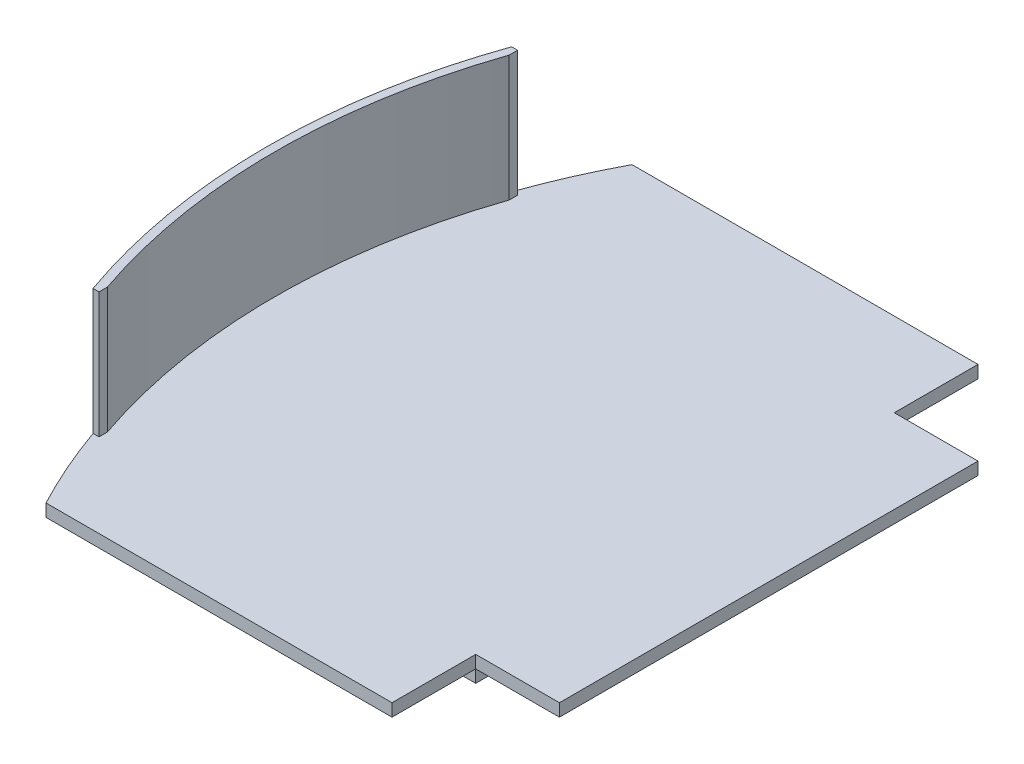
ISO-10303-21;
HEADER;
FILE_DESCRIPTION(('STEP AP214'),'2;1');
FILE_NAME('part.step','',(''),(''),'','','');
FILE_SCHEMA(('AUTOMOTIVE_DESIGN { 1 0 10303 214 1 1 1 1 }'));
ENDSEC;
DATA;
#1=APPLICATION_CONTEXT('core data for automotive mechanical design processes');
#2=APPLICATION_PROTOCOL_DEFINITION('international standard','automotive_design',2000,#1);
#3=PRODUCT_CONTEXT('',#1,'mechanical');
#4=PRODUCT('Part','Part','',(#3));
#5=PRODUCT_RELATED_PRODUCT_CATEGORY('part','',(#4));
#6=PRODUCT_DEFINITION_FORMATION('','',#4);
#7=PRODUCT_DEFINITION_CONTEXT('part definition',#1,'design');
#8=PRODUCT_DEFINITION('design','',#6,#7);
#9=PRODUCT_DEFINITION_SHAPE('','',#8);
#10=(LENGTH_UNIT() NAMED_UNIT(*) SI_UNIT(.MILLI.,.METRE.));
#11=(NAMED_UNIT(*) PLANE_ANGLE_UNIT() SI_UNIT($,.RADIAN.));
#12=(NAMED_UNIT(*) SI_UNIT($,.STERADIAN.) SOLID_ANGLE_UNIT());
#13=UNCERTAINTY_MEASURE_WITH_UNIT(LENGTH_MEASURE(1.E-05),#10,'distance_accuracy_value','');
#14=(GEOMETRIC_REPRESENTATION_CONTEXT(3) GLOBAL_UNCERTAINTY_ASSIGNED_CONTEXT((#13)) GLOBAL_UNIT_ASSIGNED_CONTEXT((#10,
#11,#12)) REPRESENTATION_CONTEXT('',''));
#15=CARTESIAN_POINT('',(0.,0.,0.));
#16=DIRECTION('',(0.,0.,1.));
#17=DIRECTION('',(1.,0.,0.));
#18=AXIS2_PLACEMENT_3D('',#15,#16,#17);
#19=CARTESIAN_POINT('',(-233.563874270696,36.,0.));
#20=DIRECTION('',(0.,1.,0.));
#21=DIRECTION('',(0.,0.,1.));
#22=AXIS2_PLACEMENT_3D('',#19,#20,#21);
#23=PLANE('',#22);
#24=DIRECTION('',(0.,0.,1.));
#25=VECTOR('',#24,1.);
#26=CARTESIAN_POINT('',(-140.,36.,-70.000025));
#27=LINE('',#26,#25);
#28=CARTESIAN_POINT('',(-140.,36.,-50.));
#29=VERTEX_POINT('',#28);
#30=CARTESIAN_POINT('',(-140.,36.,-48.));
#31=VERTEX_POINT('',#30);
#32=EDGE_CURVE('E189',#29,#31,#27,.T.);
#33=ORIENTED_EDGE('',*,*,#32,.F.);
#34=DIRECTION('',(-1.,0.,0.));
#35=VECTOR('',#34,1.);
#36=CARTESIAN_POINT('',(-233.563874270696,36.,-50.));
#37=LINE('',#36,#35);
#38=CARTESIAN_POINT('',(-141.42135623731,36.,-50.));
#39=VERTEX_POINT('',#38);
#40=EDGE_CURVE('E200',#29,#39,#37,.T.);
#41=ORIENTED_EDGE('',*,*,#40,.T.);
#42=CARTESIAN_POINT('',(0.,36.,0.));
#43=DIRECTION('',(0.,1.,0.));
#44=DIRECTION('',(0.,0.,1.));
#45=AXIS2_PLACEMENT_3D('',#42,#43,#44);
#46=CIRCLE('',#45,150.);
#47=CARTESIAN_POINT('',(-141.42135623731,36.,50.));
#48=VERTEX_POINT('',#47);
#49=EDGE_CURVE('E201',#39,#48,#46,.T.);
#50=ORIENTED_EDGE('',*,*,#49,.T.);
#51=DIRECTION('',(-1.,0.,0.));
#52=VECTOR('',#51,1.);
#53=CARTESIAN_POINT('',(-233.563874270696,36.,50.));
#54=LINE('',#53,#52);
#55=CARTESIAN_POINT('',(-140.,36.,50.));
#56=VERTEX_POINT('',#55);
#57=EDGE_CURVE('E214',#56,#48,#54,.T.);
#58=ORIENTED_EDGE('',*,*,#57,.F.);
#59=CARTESIAN_POINT('',(-140.,36.,48.));
#60=VERTEX_POINT('',#59);
#61=EDGE_CURVE('E60',#60,#56,#27,.T.);
#62=ORIENTED_EDGE('',*,*,#61,.F.);
#63=CARTESIAN_POINT('',(1.13797860024079E-12,36.,0.));
#64=DIRECTION('',(0.,1.,0.));
#65=DIRECTION('',(0.,0.,1.));
#66=AXIS2_PLACEMENT_3D('',#63,#64,#65);
#67=CIRCLE('',#66,148.000000000001);
#68=EDGE_CURVE('E371',#31,#60,#67,.T.);
#69=ORIENTED_EDGE('',*,*,#68,.F.);
#70=EDGE_LOOP('',(#33,#41,#50,#58,#62,#69));
#71=FACE_BOUND('',#70,.T.);
#72=ADVANCED_FACE('F34',(#71),#23,.T.);
#73=CARTESIAN_POINT('',(0.,6.,0.));
#74=DIRECTION('',(0.,-1.,0.));
#75=DIRECTION('',(0.,0.,-1.));
#76=AXIS2_PLACEMENT_3D('',#73,#74,#75);
#77=CYLINDRICAL_SURFACE('',#76,148.);
#78=DIRECTION('',(0.,-1.,0.));
#79=VECTOR('',#78,1.);
#80=CARTESIAN_POINT('',(-140.,34.,48.));
#81=LINE('',#80,#79);
#82=CARTESIAN_POINT('',(-140.,6.,48.));
#83=VERTEX_POINT('',#82);
#84=EDGE_CURVE('E381',#60,#83,#81,.T.);
#85=ORIENTED_EDGE('',*,*,#84,.T.);
#86=CARTESIAN_POINT('',(0.,6.,0.));
#87=DIRECTION('',(0.,-1.,0.));
#88=DIRECTION('',(0.,0.,-1.));
#89=AXIS2_PLACEMENT_3D('',#86,#87,#88);
#90=CIRCLE('',#89,148.);
#91=CARTESIAN_POINT('',(-140.,6.,-48.));
#92=VERTEX_POINT('',#91);
#93=EDGE_CURVE('E187',#83,#92,#90,.T.);
#94=ORIENTED_EDGE('',*,*,#93,.T.);
#95=DIRECTION('',(0.,-1.,0.));
#96=VECTOR('',#95,1.);
#97=CARTESIAN_POINT('',(-140.,34.,-48.));
#98=LINE('',#97,#96);
#99=EDGE_CURVE('E383',#31,#92,#98,.T.);
#100=ORIENTED_EDGE('',*,*,#99,.F.);
#101=ORIENTED_EDGE('',*,*,#68,.T.);
#102=EDGE_LOOP('',(#85,#94,#100,#101));
#103=FACE_BOUND('',#102,.T.);
#104=ADVANCED_FACE('F431',(#103),#77,.F.);
#105=CARTESIAN_POINT('',(0.,6.,0.));
#106=DIRECTION('',(0.,-1.,0.));
#107=DIRECTION('',(0.,0.,-1.));
#108=AXIS2_PLACEMENT_3D('',#105,#106,#107);
#109=CYLINDRICAL_SURFACE('',#108,150.);
#110=CARTESIAN_POINT('',(0.,3.,0.));
#111=DIRECTION('',(0.,-1.,0.));
#112=DIRECTION('',(0.,0.,-1.));
#113=AXIS2_PLACEMENT_3D('',#110,#111,#112);
#114=CIRCLE('',#113,150.);
#115=CARTESIAN_POINT('',(-141.42135623731,3.,-50.));
#116=VERTEX_POINT('',#115);
#117=CARTESIAN_POINT('',(-132.664991614216,3.,-70.));
#118=VERTEX_POINT('',#117);
#119=EDGE_CURVE('E403',#116,#118,#114,.T.);
#120=ORIENTED_EDGE('',*,*,#119,.F.);
#121=DIRECTION('',(0.,-1.,0.));
#122=VECTOR('',#121,1.);
#123=CARTESIAN_POINT('',(-141.42135623731,3.,-50.));
#124=LINE('',#123,#122);
#125=CARTESIAN_POINT('',(-141.42135623731,0.,-50.));
#126=VERTEX_POINT('',#125);
#127=EDGE_CURVE('E204',#116,#126,#124,.T.);
#128=ORIENTED_EDGE('',*,*,#127,.T.);
#129=CARTESIAN_POINT('',(0.,0.,0.));
#130=DIRECTION('',(0.,1.,0.));
#131=DIRECTION('',(0.,0.,1.));
#132=AXIS2_PLACEMENT_3D('',#129,#130,#131);
#133=CIRCLE('',#132,150.);
#134=CARTESIAN_POINT('',(-141.42135623731,0.,50.));
#135=VERTEX_POINT('',#134);
#136=EDGE_CURVE('E264',#126,#135,#133,.T.);
#137=ORIENTED_EDGE('',*,*,#136,.T.);
#138=DIRECTION('',(0.,-1.,0.));
#139=VECTOR('',#138,1.);
#140=CARTESIAN_POINT('',(-141.42135623731,3.,50.));
#141=LINE('',#140,#139);
#142=CARTESIAN_POINT('',(-141.42135623731,3.,50.));
#143=VERTEX_POINT('',#142);
#144=EDGE_CURVE('E388',#143,#135,#141,.T.);
#145=ORIENTED_EDGE('',*,*,#144,.F.);
#146=CARTESIAN_POINT('',(0.,3.,0.));
#147=DIRECTION('',(0.,-1.,0.));
#148=DIRECTION('',(0.,0.,-1.));
#149=AXIS2_PLACEMENT_3D('',#146,#147,#148);
#150=CIRCLE('',#149,150.);
#151=CARTESIAN_POINT('',(-132.664991614216,3.,70.));
#152=VERTEX_POINT('',#151);
#153=EDGE_CURVE('E387',#152,#143,#150,.T.);
#154=ORIENTED_EDGE('',*,*,#153,.F.);
#155=DIRECTION('',(0.,-1.,0.));
#156=VECTOR('',#155,1.);
#157=CARTESIAN_POINT('',(-132.664991614216,6.,70.));
#158=LINE('',#157,#156);
#159=CARTESIAN_POINT('',(-132.664991614216,6.,70.));
#160=VERTEX_POINT('',#159);
#161=EDGE_CURVE('E246',#160,#152,#158,.T.);
#162=ORIENTED_EDGE('',*,*,#161,.F.);
#163=CARTESIAN_POINT('',(0.,6.,0.));
#164=DIRECTION('',(0.,1.,0.));
#165=DIRECTION('',(0.,0.,1.));
#166=AXIS2_PLACEMENT_3D('',#163,#164,#165);
#167=CIRCLE('',#166,150.);
#168=CARTESIAN_POINT('',(-141.42135623731,6.,50.));
#169=VERTEX_POINT('',#168);
#170=EDGE_CURVE('E231',#169,#160,#167,.T.);
#171=ORIENTED_EDGE('',*,*,#170,.F.);
#172=DIRECTION('',(0.,-1.,0.));
#173=VECTOR('',#172,1.);
#174=CARTESIAN_POINT('',(-141.42135623731,36.,50.));
#175=LINE('',#174,#173);
#176=EDGE_CURVE('E199',#48,#169,#175,.T.);
#177=ORIENTED_EDGE('',*,*,#176,.F.);
#178=ORIENTED_EDGE('',*,*,#49,.F.);
#179=DIRECTION('',(0.,-1.,0.));
#180=VECTOR('',#179,1.);
#181=CARTESIAN_POINT('',(-141.42135623731,36.,-50.));
#182=LINE('',#181,#180);
#183=CARTESIAN_POINT('',(-141.42135623731,6.,-50.));
#184=VERTEX_POINT('',#183);
#185=EDGE_CURVE('E213',#39,#184,#182,.T.);
#186=ORIENTED_EDGE('',*,*,#185,.T.);
#187=CARTESIAN_POINT('',(-132.664991614216,6.,-70.));
#188=VERTEX_POINT('',#187);
#189=EDGE_CURVE('E239',#188,#184,#167,.T.);
#190=ORIENTED_EDGE('',*,*,#189,.F.);
#191=DIRECTION('',(0.,-1.,0.));
#192=VECTOR('',#191,1.);
#193=CARTESIAN_POINT('',(-132.664991614216,6.,-70.));
#194=LINE('',#193,#192);
#195=EDGE_CURVE('E243',#188,#118,#194,.T.);
#196=ORIENTED_EDGE('',*,*,#195,.T.);
#197=EDGE_LOOP('',(#120,#128,#137,#145,#154,#162,#171,#177,#178,#186,#190,#196));
#198=FACE_BOUND('',#197,.T.);
#199=ADVANCED_FACE('F334',(#198),#109,.T.);
#200=CARTESIAN_POINT('',(-233.563874270696,6.,70.));
#201=DIRECTION('',(0.,0.,-1.));
#202=DIRECTION('',(-1.,0.,0.));
#203=AXIS2_PLACEMENT_3D('',#200,#201,#202);
#204=PLANE('',#203);
#205=DIRECTION('',(-1.,0.,0.));
#206=VECTOR('',#205,1.);
#207=CARTESIAN_POINT('',(-90.,3.,70.));
#208=LINE('',#207,#206);
#209=CARTESIAN_POINT('',(-50.,3.,70.));
#210=VERTEX_POINT('',#209);
#211=EDGE_CURVE('E283',#210,#152,#208,.T.);
#212=ORIENTED_EDGE('',*,*,#211,.F.);
#213=DIRECTION('',(0.,-1.,0.));
#214=VECTOR('',#213,1.);
#215=CARTESIAN_POINT('',(-50.,6.,70.));
#216=LINE('',#215,#214);
#217=CARTESIAN_POINT('',(-50.,6.,70.));
#218=VERTEX_POINT('',#217);
#219=EDGE_CURVE('E249',#218,#210,#216,.T.);
#220=ORIENTED_EDGE('',*,*,#219,.F.);
#221=DIRECTION('',(1.,0.,0.));
#222=VECTOR('',#221,1.);
#223=CARTESIAN_POINT('',(-233.563874270696,6.,70.));
#224=LINE('',#223,#222);
#225=EDGE_CURVE('E234',#160,#218,#224,.T.);
#226=ORIENTED_EDGE('',*,*,#225,.F.);
#227=ORIENTED_EDGE('',*,*,#161,.T.);
#228=EDGE_LOOP('',(#212,#220,#226,#227));
#229=FACE_BOUND('',#228,.T.);
#230=ADVANCED_FACE('F282',(#229),#204,.F.);
#231=CARTESIAN_POINT('',(-50.,6.,0.));
#232=DIRECTION('',(1.,0.,0.));
#233=DIRECTION('',(0.,0.,-1.));
#234=AXIS2_PLACEMENT_3D('',#231,#232,#233);
#235=PLANE('',#234);
#236=DIRECTION('',(0.,0.,-1.));
#237=VECTOR('',#236,1.);
#238=CARTESIAN_POINT('',(-50.,3.,-143.563874270696));
#239=LINE('',#238,#237);
#240=CARTESIAN_POINT('',(-50.,3.,50.));
#241=VERTEX_POINT('',#240);
#242=CARTESIAN_POINT('',(-50.,3.,-50.));
#243=VERTEX_POINT('',#242);
#244=EDGE_CURVE('E295',#241,#243,#239,.T.);
#245=ORIENTED_EDGE('',*,*,#244,.F.);
#246=DIRECTION('',(0.,-1.,0.));
#247=VECTOR('',#246,1.);
#248=CARTESIAN_POINT('',(-50.,3.,50.));
#249=LINE('',#248,#247);
#250=CARTESIAN_POINT('',(-50.,0.,50.));
#251=VERTEX_POINT('',#250);
#252=EDGE_CURVE('E298',#241,#251,#249,.T.);
#253=ORIENTED_EDGE('',*,*,#252,.T.);
#254=DIRECTION('',(0.,0.,1.));
#255=VECTOR('',#254,1.);
#256=CARTESIAN_POINT('',(-50.,0.,0.));
#257=LINE('',#256,#255);
#258=CARTESIAN_POINT('',(-50.,0.,-50.));
#259=VERTEX_POINT('',#258);
#260=EDGE_CURVE('E226',#259,#251,#257,.T.);
#261=ORIENTED_EDGE('',*,*,#260,.F.);
#262=DIRECTION('',(0.,-1.,0.));
#263=VECTOR('',#262,1.);
#264=CARTESIAN_POINT('',(-50.,3.,-50.));
#265=LINE('',#264,#263);
#266=EDGE_CURVE('E300',#243,#259,#265,.T.);
#267=ORIENTED_EDGE('',*,*,#266,.F.);
#268=EDGE_LOOP('',(#245,#253,#261,#267));
#269=FACE_BOUND('',#268,.T.);
#270=ADVANCED_FACE('F297',(#269),#235,.T.);
#271=ORIENTED_EDGE('',*,*,#219,.T.);
#272=DIRECTION('',(0.,0.,1.));
#273=VECTOR('',#272,1.);
#274=CARTESIAN_POINT('',(-50.,3.,-143.563874270696));
#275=LINE('',#274,#273);
#276=EDGE_CURVE('E286',#241,#210,#275,.T.);
#277=ORIENTED_EDGE('',*,*,#276,.F.);
#278=DIRECTION('',(0.,-1.,0.));
#279=VECTOR('',#278,1.);
#280=CARTESIAN_POINT('',(-50.,6.,50.));
#281=LINE('',#280,#279);
#282=CARTESIAN_POINT('',(-50.,6.,50.));
#283=VERTEX_POINT('',#282);
#284=EDGE_CURVE('E252',#283,#241,#281,.T.);
#285=ORIENTED_EDGE('',*,*,#284,.F.);
#286=DIRECTION('',(0.,0.,1.));
#287=VECTOR('',#286,1.);
#288=CARTESIAN_POINT('',(-50.,6.,0.));
#289=LINE('',#288,#287);
#290=EDGE_CURVE('E272',#283,#218,#289,.T.);
#291=ORIENTED_EDGE('',*,*,#290,.T.);
#292=EDGE_LOOP('',(#271,#277,#285,#291));
#293=FACE_BOUND('',#292,.T.);
#294=ADVANCED_FACE('F285',(#293),#235,.T.);
#295=CARTESIAN_POINT('',(-233.563874270696,0.,0.));
#296=DIRECTION('',(0.,1.,0.));
#297=DIRECTION('',(0.,0.,1.));
#298=AXIS2_PLACEMENT_3D('',#295,#296,#297);
#299=PLANE('',#298);
#300=DIRECTION('',(-1.,0.,0.));
#301=VECTOR('',#300,1.);
#302=CARTESIAN_POINT('',(-100.,0.,16.));
#303=LINE('',#302,#301);
#304=CARTESIAN_POINT('',(-110.,0.,16.));
#305=VERTEX_POINT('',#304);
#306=CARTESIAN_POINT('',(-131.,0.,16.));
#307=VERTEX_POINT('',#306);
#308=EDGE_CURVE('E344',#305,#307,#303,.T.);
#309=ORIENTED_EDGE('',*,*,#308,.F.);
#310=DIRECTION('',(0.,0.,1.));
#311=VECTOR('',#310,1.);
#312=CARTESIAN_POINT('',(-110.,0.,-110.141421356237));
#313=LINE('',#312,#311);
#314=CARTESIAN_POINT('',(-110.,0.,-28.));
#315=VERTEX_POINT('',#314);
#316=EDGE_CURVE('E342',#315,#305,#313,.T.);
#317=ORIENTED_EDGE('',*,*,#316,.F.);
#318=DIRECTION('',(1.,0.,0.));
#319=VECTOR('',#318,1.);
#320=CARTESIAN_POINT('',(-100.,0.,-28.));
#321=LINE('',#320,#319);
#322=CARTESIAN_POINT('',(-131.,0.,-28.));
#323=VERTEX_POINT('',#322);
#324=EDGE_CURVE('E352',#323,#315,#321,.T.);
#325=ORIENTED_EDGE('',*,*,#324,.F.);
#326=DIRECTION('',(0.,0.,-1.));
#327=VECTOR('',#326,1.);
#328=CARTESIAN_POINT('',(-131.,0.,-110.141421356237));
#329=LINE('',#328,#327);
#330=EDGE_CURVE('E364',#307,#323,#329,.T.);
#331=ORIENTED_EDGE('',*,*,#330,.F.);
#332=EDGE_LOOP('',(#309,#317,#325,#331));
#333=FACE_BOUND('',#332,.T.);
#334=DIRECTION('',(-1.,0.,0.));
#335=VECTOR('',#334,1.);
#336=CARTESIAN_POINT('',(-90.,0.,50.));
#337=LINE('',#336,#335);
#338=EDGE_CURVE('E385',#251,#135,#337,.T.);
#339=ORIENTED_EDGE('',*,*,#338,.T.);
#340=ORIENTED_EDGE('',*,*,#136,.F.);
#341=DIRECTION('',(-1.,0.,0.));
#342=VECTOR('',#341,1.);
#343=CARTESIAN_POINT('',(-233.563874270696,0.,-50.));
#344=LINE('',#343,#342);
#345=EDGE_CURVE('E216',#259,#126,#344,.T.);
#346=ORIENTED_EDGE('',*,*,#345,.F.);
#347=ORIENTED_EDGE('',*,*,#260,.T.);
#348=EDGE_LOOP('',(#339,#340,#346,#347));
#349=FACE_BOUND('',#348,.T.);
#350=ADVANCED_FACE('F413',(#333,#349),#299,.F.);
#351=CARTESIAN_POINT('',(-233.563874270696,6.,-50.));
#352=DIRECTION('',(0.,0.,1.));
#353=DIRECTION('',(1.,0.,0.));
#354=AXIS2_PLACEMENT_3D('',#351,#352,#353);
#355=PLANE('',#354);
#356=DIRECTION('',(1.,0.,0.));
#357=VECTOR('',#356,1.);
#358=CARTESIAN_POINT('',(-90.,3.,-50.));
#359=LINE('',#358,#357);
#360=CARTESIAN_POINT('',(-30.,3.,-50.));
#361=VERTEX_POINT('',#360);
#362=EDGE_CURVE('E303',#243,#361,#359,.T.);
#363=ORIENTED_EDGE('',*,*,#362,.F.);
#364=DIRECTION('',(0.,-1.,0.));
#365=VECTOR('',#364,1.);
#366=CARTESIAN_POINT('',(-50.,6.,-50.));
#367=LINE('',#366,#365);
#368=CARTESIAN_POINT('',(-50.,6.,-50.));
#369=VERTEX_POINT('',#368);
#370=EDGE_CURVE('E11',#369,#243,#367,.T.);
#371=ORIENTED_EDGE('',*,*,#370,.F.);
#372=DIRECTION('',(-1.,0.,0.));
#373=VECTOR('',#372,1.);
#374=CARTESIAN_POINT('',(-233.563874270696,6.,-50.));
#375=LINE('',#374,#373);
#376=CARTESIAN_POINT('',(-30.,6.,-50.));
#377=VERTEX_POINT('',#376);
#378=EDGE_CURVE('E222',#377,#369,#375,.T.);
#379=ORIENTED_EDGE('',*,*,#378,.F.);
#380=DIRECTION('',(0.,-1.,0.));
#381=VECTOR('',#380,1.);
#382=CARTESIAN_POINT('',(-30.,6.,-50.));
#383=LINE('',#382,#381);
#384=EDGE_CURVE('E258',#377,#361,#383,.T.);
#385=ORIENTED_EDGE('',*,*,#384,.T.);
#386=EDGE_LOOP('',(#363,#371,#379,#385));
#387=FACE_BOUND('',#386,.T.);
#388=ADVANCED_FACE('F319',(#387),#355,.F.);
#389=CARTESIAN_POINT('',(-233.563874270696,6.,50.));
#390=DIRECTION('',(0.,0.,1.));
#391=DIRECTION('',(1.,0.,0.));
#392=AXIS2_PLACEMENT_3D('',#389,#390,#391);
#393=PLANE('',#392);
#394=ORIENTED_EDGE('',*,*,#284,.T.);
#395=DIRECTION('',(-1.,0.,0.));
#396=VECTOR('',#395,1.);
#397=CARTESIAN_POINT('',(-90.,3.,50.));
#398=LINE('',#397,#396);
#399=CARTESIAN_POINT('',(-30.,3.,50.));
#400=VERTEX_POINT('',#399);
#401=EDGE_CURVE('E306',#400,#241,#398,.T.);
#402=ORIENTED_EDGE('',*,*,#401,.F.);
#403=DIRECTION('',(0.,-1.,0.));
#404=VECTOR('',#403,1.);
#405=CARTESIAN_POINT('',(-30.,6.,50.));
#406=LINE('',#405,#404);
#407=CARTESIAN_POINT('',(-30.,6.,50.));
#408=VERTEX_POINT('',#407);
#409=EDGE_CURVE('E255',#408,#400,#406,.T.);
#410=ORIENTED_EDGE('',*,*,#409,.F.);
#411=DIRECTION('',(-1.,0.,0.));
#412=VECTOR('',#411,1.);
#413=CARTESIAN_POINT('',(-233.563874270696,6.,50.));
#414=LINE('',#413,#412);
#415=EDGE_CURVE('E270',#408,#283,#414,.T.);
#416=ORIENTED_EDGE('',*,*,#415,.T.);
#417=EDGE_LOOP('',(#394,#402,#410,#416));
#418=FACE_BOUND('',#417,.T.);
#419=ADVANCED_FACE('F312',(#418),#393,.T.);
#420=CARTESIAN_POINT('',(-30.,6.,0.));
#421=DIRECTION('',(1.,0.,0.));
#422=DIRECTION('',(0.,0.,-1.));
#423=AXIS2_PLACEMENT_3D('',#420,#421,#422);
#424=PLANE('',#423);
#425=ORIENTED_EDGE('',*,*,#409,.T.);
#426=DIRECTION('',(0.,0.,1.));
#427=VECTOR('',#426,1.);
#428=CARTESIAN_POINT('',(-30.,3.,-143.563874270696));
#429=LINE('',#428,#427);
#430=EDGE_CURVE('E309',#361,#400,#429,.T.);
#431=ORIENTED_EDGE('',*,*,#430,.F.);
#432=ORIENTED_EDGE('',*,*,#384,.F.);
#433=DIRECTION('',(0.,0.,1.));
#434=VECTOR('',#433,1.);
#435=CARTESIAN_POINT('',(-30.,6.,0.));
#436=LINE('',#435,#434);
#437=EDGE_CURVE('E261',#377,#408,#436,.T.);
#438=ORIENTED_EDGE('',*,*,#437,.T.);
#439=EDGE_LOOP('',(#425,#431,#432,#438));
#440=FACE_BOUND('',#439,.T.);
#441=ADVANCED_FACE('F315',(#440),#424,.T.);
#442=CARTESIAN_POINT('',(-50.,6.,0.));
#443=DIRECTION('',(-1.,0.,0.));
#444=DIRECTION('',(0.,0.,1.));
#445=AXIS2_PLACEMENT_3D('',#442,#443,#444);
#446=PLANE('',#445);
#447=DIRECTION('',(0.,0.,1.));
#448=VECTOR('',#447,1.);
#449=CARTESIAN_POINT('',(-50.,3.,-143.563874270696));
#450=LINE('',#449,#448);
#451=CARTESIAN_POINT('',(-50.,3.,-70.));
#452=VERTEX_POINT('',#451);
#453=EDGE_CURVE('E326',#452,#243,#450,.T.);
#454=ORIENTED_EDGE('',*,*,#453,.F.);
#455=DIRECTION('',(0.,-1.,0.));
#456=VECTOR('',#455,1.);
#457=CARTESIAN_POINT('',(-50.,6.,-70.));
#458=LINE('',#457,#456);
#459=CARTESIAN_POINT('',(-50.,6.,-70.));
#460=VERTEX_POINT('',#459);
#461=EDGE_CURVE('E44',#460,#452,#458,.T.);
#462=ORIENTED_EDGE('',*,*,#461,.F.);
#463=DIRECTION('',(0.,0.,-1.));
#464=VECTOR('',#463,1.);
#465=CARTESIAN_POINT('',(-50.,6.,0.));
#466=LINE('',#465,#464);
#467=EDGE_CURVE('E225',#369,#460,#466,.T.);
#468=ORIENTED_EDGE('',*,*,#467,.F.);
#469=ORIENTED_EDGE('',*,*,#370,.T.);
#470=EDGE_LOOP('',(#454,#462,#468,#469));
#471=FACE_BOUND('',#470,.T.);
#472=ADVANCED_FACE('F324',(#471),#446,.F.);
#473=CARTESIAN_POINT('',(-233.563874270696,6.,-70.));
#474=DIRECTION('',(0.,0.,-1.));
#475=DIRECTION('',(-1.,0.,0.));
#476=AXIS2_PLACEMENT_3D('',#473,#474,#475);
#477=PLANE('',#476);
#478=ORIENTED_EDGE('',*,*,#461,.T.);
#479=DIRECTION('',(1.,0.,0.));
#480=VECTOR('',#479,1.);
#481=CARTESIAN_POINT('',(-90.,3.,-70.));
#482=LINE('',#481,#480);
#483=EDGE_CURVE('E331',#118,#452,#482,.T.);
#484=ORIENTED_EDGE('',*,*,#483,.F.);
#485=ORIENTED_EDGE('',*,*,#195,.F.);
#486=DIRECTION('',(1.,0.,0.));
#487=VECTOR('',#486,1.);
#488=CARTESIAN_POINT('',(-233.563874270696,6.,-70.));
#489=LINE('',#488,#487);
#490=EDGE_CURVE('E228',#188,#460,#489,.T.);
#491=ORIENTED_EDGE('',*,*,#490,.T.);
#492=EDGE_LOOP('',(#478,#484,#485,#491));
#493=FACE_BOUND('',#492,.T.);
#494=ADVANCED_FACE('F329',(#493),#477,.T.);
#495=DIRECTION('',(-1.,0.,0.));
#496=VECTOR('',#495,1.);
#497=CARTESIAN_POINT('',(-90.,3.,-50.));
#498=LINE('',#497,#496);
#499=EDGE_CURVE('E400',#243,#116,#498,.T.);
#500=ORIENTED_EDGE('',*,*,#499,.F.);
#501=ORIENTED_EDGE('',*,*,#266,.T.);
#502=ORIENTED_EDGE('',*,*,#345,.T.);
#503=ORIENTED_EDGE('',*,*,#127,.F.);
#504=EDGE_LOOP('',(#500,#501,#502,#503));
#505=FACE_BOUND('',#504,.T.);
#506=ADVANCED_FACE('F36',(#505),#355,.F.);
#507=CARTESIAN_POINT('',(-233.563874270696,6.,0.));
#508=DIRECTION('',(0.,1.,0.));
#509=DIRECTION('',(0.,0.,1.));
#510=AXIS2_PLACEMENT_3D('',#507,#508,#509);
#511=PLANE('',#510);
#512=DIRECTION('',(-1.,0.,0.));
#513=VECTOR('',#512,1.);
#514=CARTESIAN_POINT('',(-233.563874270696,6.,-50.));
#515=LINE('',#514,#513);
#516=CARTESIAN_POINT('',(-140.,6.,-50.));
#517=VERTEX_POINT('',#516);
#518=EDGE_CURVE('E38',#517,#184,#515,.T.);
#519=ORIENTED_EDGE('',*,*,#518,.F.);
#520=DIRECTION('',(0.,0.,1.));
#521=VECTOR('',#520,1.);
#522=CARTESIAN_POINT('',(-140.,6.,-70.000025));
#523=LINE('',#522,#521);
#524=EDGE_CURVE('E52',#517,#92,#523,.T.);
#525=ORIENTED_EDGE('',*,*,#524,.T.);
#526=ORIENTED_EDGE('',*,*,#93,.F.);
#527=CARTESIAN_POINT('',(-140.,6.,50.));
#528=VERTEX_POINT('',#527);
#529=EDGE_CURVE('E180',#83,#528,#523,.T.);
#530=ORIENTED_EDGE('',*,*,#529,.T.);
#531=DIRECTION('',(-1.,0.,0.));
#532=VECTOR('',#531,1.);
#533=CARTESIAN_POINT('',(-233.563874270696,6.,50.));
#534=LINE('',#533,#532);
#535=EDGE_CURVE('E184',#528,#169,#534,.T.);
#536=ORIENTED_EDGE('',*,*,#535,.T.);
#537=ORIENTED_EDGE('',*,*,#170,.T.);
#538=ORIENTED_EDGE('',*,*,#225,.T.);
#539=ORIENTED_EDGE('',*,*,#290,.F.);
#540=ORIENTED_EDGE('',*,*,#415,.F.);
#541=ORIENTED_EDGE('',*,*,#437,.F.);
#542=ORIENTED_EDGE('',*,*,#378,.T.);
#543=ORIENTED_EDGE('',*,*,#467,.T.);
#544=ORIENTED_EDGE('',*,*,#490,.F.);
#545=ORIENTED_EDGE('',*,*,#189,.T.);
#546=EDGE_LOOP('',(#519,#525,#526,#530,#536,#537,#538,#539,#540,#541,#542,#543,#544,#545));
#547=FACE_BOUND('',#546,.T.);
#548=ADVANCED_FACE('F182',(#547),#511,.T.);
#549=CARTESIAN_POINT('',(-233.563874270696,36.,-50.));
#550=DIRECTION('',(0.,0.,1.));
#551=DIRECTION('',(1.,0.,0.));
#552=AXIS2_PLACEMENT_3D('',#549,#550,#551);
#553=PLANE('',#552);
#554=ORIENTED_EDGE('',*,*,#40,.F.);
#555=DIRECTION('',(0.,-1.,0.));
#556=VECTOR('',#555,1.);
#557=CARTESIAN_POINT('',(-140.,36.,-50.));
#558=LINE('',#557,#556);
#559=EDGE_CURVE('E340',#29,#517,#558,.T.);
#560=ORIENTED_EDGE('',*,*,#559,.T.);
#561=ORIENTED_EDGE('',*,*,#518,.T.);
#562=ORIENTED_EDGE('',*,*,#185,.F.);
#563=EDGE_LOOP('',(#554,#560,#561,#562));
#564=FACE_BOUND('',#563,.T.);
#565=ADVANCED_FACE('F339',(#564),#553,.F.);
#566=CARTESIAN_POINT('',(-233.563874270696,36.,50.));
#567=DIRECTION('',(0.,0.,1.));
#568=DIRECTION('',(1.,0.,0.));
#569=AXIS2_PLACEMENT_3D('',#566,#567,#568);
#570=PLANE('',#569);
#571=DIRECTION('',(0.,-1.,0.));
#572=VECTOR('',#571,1.);
#573=CARTESIAN_POINT('',(-140.,36.,50.));
#574=LINE('',#573,#572);
#575=EDGE_CURVE('E191',#56,#528,#574,.T.);
#576=ORIENTED_EDGE('',*,*,#575,.F.);
#577=ORIENTED_EDGE('',*,*,#57,.T.);
#578=ORIENTED_EDGE('',*,*,#176,.T.);
#579=ORIENTED_EDGE('',*,*,#535,.F.);
#580=EDGE_LOOP('',(#576,#577,#578,#579));
#581=FACE_BOUND('',#580,.T.);
#582=ADVANCED_FACE('F197',(#581),#570,.T.);
#583=CARTESIAN_POINT('',(-90.,3.,-143.563874270696));
#584=DIRECTION('',(0.,-1.,0.));
#585=DIRECTION('',(0.,0.,-1.));
#586=AXIS2_PLACEMENT_3D('',#583,#584,#585);
#587=PLANE('',#586);
#588=ORIENTED_EDGE('',*,*,#453,.T.);
#589=ORIENTED_EDGE('',*,*,#499,.T.);
#590=ORIENTED_EDGE('',*,*,#119,.T.);
#591=ORIENTED_EDGE('',*,*,#483,.T.);
#592=EDGE_LOOP('',(#588,#589,#590,#591));
#593=FACE_BOUND('',#592,.T.);
#594=ADVANCED_FACE('F441',(#593),#587,.T.);
#595=CARTESIAN_POINT('',(-90.,3.,-143.563874270696));
#596=DIRECTION('',(0.,-1.,0.));
#597=DIRECTION('',(0.,0.,-1.));
#598=AXIS2_PLACEMENT_3D('',#595,#596,#597);
#599=PLANE('',#598);
#600=ORIENTED_EDGE('',*,*,#401,.T.);
#601=ORIENTED_EDGE('',*,*,#244,.T.);
#602=ORIENTED_EDGE('',*,*,#362,.T.);
#603=ORIENTED_EDGE('',*,*,#430,.T.);
#604=EDGE_LOOP('',(#600,#601,#602,#603));
#605=FACE_BOUND('',#604,.T.);
#606=ADVANCED_FACE('F307',(#605),#599,.T.);
#607=CARTESIAN_POINT('',(-90.,3.,50.));
#608=DIRECTION('',(0.,0.,1.));
#609=DIRECTION('',(1.,0.,0.));
#610=AXIS2_PLACEMENT_3D('',#607,#608,#609);
#611=PLANE('',#610);
#612=ORIENTED_EDGE('',*,*,#338,.F.);
#613=ORIENTED_EDGE('',*,*,#252,.F.);
#614=DIRECTION('',(-1.,0.,0.));
#615=VECTOR('',#614,1.);
#616=CARTESIAN_POINT('',(-90.,3.,50.));
#617=LINE('',#616,#615);
#618=EDGE_CURVE('E290',#241,#143,#617,.T.);
#619=ORIENTED_EDGE('',*,*,#618,.T.);
#620=ORIENTED_EDGE('',*,*,#144,.T.);
#621=EDGE_LOOP('',(#612,#613,#619,#620));
#622=FACE_BOUND('',#621,.T.);
#623=ADVANCED_FACE('F415',(#622),#611,.T.);
#624=CARTESIAN_POINT('',(-90.,3.,-143.563874270696));
#625=DIRECTION('',(0.,-1.,0.));
#626=DIRECTION('',(0.,0.,-1.));
#627=AXIS2_PLACEMENT_3D('',#624,#625,#626);
#628=PLANE('',#627);
#629=ORIENTED_EDGE('',*,*,#618,.F.);
#630=ORIENTED_EDGE('',*,*,#276,.T.);
#631=ORIENTED_EDGE('',*,*,#211,.T.);
#632=ORIENTED_EDGE('',*,*,#153,.T.);
#633=EDGE_LOOP('',(#629,#630,#631,#632));
#634=FACE_BOUND('',#633,.T.);
#635=ADVANCED_FACE('F417',(#634),#628,.T.);
#636=CARTESIAN_POINT('',(-110.,3.,-110.141421356237));
#637=DIRECTION('',(1.,0.,0.));
#638=DIRECTION('',(0.,0.,-1.));
#639=AXIS2_PLACEMENT_3D('',#636,#637,#638);
#640=PLANE('',#639);
#641=ORIENTED_EDGE('',*,*,#316,.T.);
#642=DIRECTION('',(0.,-1.,0.));
#643=VECTOR('',#642,1.);
#644=CARTESIAN_POINT('',(-110.,3.,16.));
#645=LINE('',#644,#643);
#646=CARTESIAN_POINT('',(-110.,3.,16.));
#647=VERTEX_POINT('',#646);
#648=EDGE_CURVE('E360',#647,#305,#645,.T.);
#649=ORIENTED_EDGE('',*,*,#648,.F.);
#650=DIRECTION('',(0.,0.,1.));
#651=VECTOR('',#650,1.);
#652=CARTESIAN_POINT('',(-110.,3.,-110.141421356237));
#653=LINE('',#652,#651);
#654=CARTESIAN_POINT('',(-110.,3.,-28.));
#655=VERTEX_POINT('',#654);
#656=EDGE_CURVE('E348',#655,#647,#653,.T.);
#657=ORIENTED_EDGE('',*,*,#656,.F.);
#658=DIRECTION('',(0.,-1.,0.));
#659=VECTOR('',#658,1.);
#660=CARTESIAN_POINT('',(-110.,3.,-28.));
#661=LINE('',#660,#659);
#662=EDGE_CURVE('E369',#655,#315,#661,.T.);
#663=ORIENTED_EDGE('',*,*,#662,.T.);
#664=EDGE_LOOP('',(#641,#649,#657,#663));
#665=FACE_BOUND('',#664,.T.);
#666=ADVANCED_FACE('F419',(#665),#640,.F.);
#667=CARTESIAN_POINT('',(-100.,3.,-28.));
#668=DIRECTION('',(0.,0.,-1.));
#669=DIRECTION('',(-1.,0.,0.));
#670=AXIS2_PLACEMENT_3D('',#667,#668,#669);
#671=PLANE('',#670);
#672=ORIENTED_EDGE('',*,*,#324,.T.);
#673=ORIENTED_EDGE('',*,*,#662,.F.);
#674=DIRECTION('',(1.,0.,0.));
#675=VECTOR('',#674,1.);
#676=CARTESIAN_POINT('',(-100.,3.,-28.));
#677=LINE('',#676,#675);
#678=CARTESIAN_POINT('',(-131.,3.,-28.));
#679=VERTEX_POINT('',#678);
#680=EDGE_CURVE('E358',#679,#655,#677,.T.);
#681=ORIENTED_EDGE('',*,*,#680,.F.);
#682=DIRECTION('',(0.,-1.,0.));
#683=VECTOR('',#682,1.);
#684=CARTESIAN_POINT('',(-131.,3.,-28.));
#685=LINE('',#684,#683);
#686=EDGE_CURVE('E372',#679,#323,#685,.T.);
#687=ORIENTED_EDGE('',*,*,#686,.T.);
#688=EDGE_LOOP('',(#672,#673,#681,#687));
#689=FACE_BOUND('',#688,.T.);
#690=ADVANCED_FACE('F425',(#689),#671,.F.);
#691=CARTESIAN_POINT('',(-131.,3.,-110.141421356237));
#692=DIRECTION('',(-1.,0.,0.));
#693=DIRECTION('',(0.,0.,1.));
#694=AXIS2_PLACEMENT_3D('',#691,#692,#693);
#695=PLANE('',#694);
#696=ORIENTED_EDGE('',*,*,#330,.T.);
#697=ORIENTED_EDGE('',*,*,#686,.F.);
#698=DIRECTION('',(0.,0.,-1.));
#699=VECTOR('',#698,1.);
#700=CARTESIAN_POINT('',(-131.,3.,-110.141421356237));
#701=LINE('',#700,#699);
#702=CARTESIAN_POINT('',(-131.,3.,16.));
#703=VERTEX_POINT('',#702);
#704=EDGE_CURVE('E355',#703,#679,#701,.T.);
#705=ORIENTED_EDGE('',*,*,#704,.F.);
#706=DIRECTION('',(0.,-1.,0.));
#707=VECTOR('',#706,1.);
#708=CARTESIAN_POINT('',(-131.,3.,16.));
#709=LINE('',#708,#707);
#710=EDGE_CURVE('E374',#703,#307,#709,.T.);
#711=ORIENTED_EDGE('',*,*,#710,.T.);
#712=EDGE_LOOP('',(#696,#697,#705,#711));
#713=FACE_BOUND('',#712,.T.);
#714=ADVANCED_FACE('F536',(#713),#695,.F.);
#715=CARTESIAN_POINT('',(-100.,3.,16.));
#716=DIRECTION('',(0.,0.,1.));
#717=DIRECTION('',(1.,0.,0.));
#718=AXIS2_PLACEMENT_3D('',#715,#716,#717);
#719=PLANE('',#718);
#720=ORIENTED_EDGE('',*,*,#308,.T.);
#721=ORIENTED_EDGE('',*,*,#710,.F.);
#722=DIRECTION('',(-1.,0.,0.));
#723=VECTOR('',#722,1.);
#724=CARTESIAN_POINT('',(-100.,3.,16.));
#725=LINE('',#724,#723);
#726=EDGE_CURVE('E351',#647,#703,#725,.T.);
#727=ORIENTED_EDGE('',*,*,#726,.F.);
#728=ORIENTED_EDGE('',*,*,#648,.T.);
#729=EDGE_LOOP('',(#720,#721,#727,#728));
#730=FACE_BOUND('',#729,.T.);
#731=ADVANCED_FACE('F546',(#730),#719,.F.);
#732=CARTESIAN_POINT('',(-100.,3.,-110.141421356237));
#733=DIRECTION('',(0.,-1.,0.));
#734=DIRECTION('',(0.,0.,-1.));
#735=AXIS2_PLACEMENT_3D('',#732,#733,#734);
#736=PLANE('',#735);
#737=ORIENTED_EDGE('',*,*,#656,.T.);
#738=ORIENTED_EDGE('',*,*,#726,.T.);
#739=ORIENTED_EDGE('',*,*,#704,.T.);
#740=ORIENTED_EDGE('',*,*,#680,.T.);
#741=EDGE_LOOP('',(#737,#738,#739,#740));
#742=FACE_BOUND('',#741,.T.);
#743=ADVANCED_FACE('F556',(#742),#736,.T.);
#744=CARTESIAN_POINT('',(-140.,36.,-70.000025));
#745=DIRECTION('',(-1.,0.,0.));
#746=DIRECTION('',(0.,0.,1.));
#747=AXIS2_PLACEMENT_3D('',#744,#745,#746);
#748=PLANE('',#747);
#749=ORIENTED_EDGE('',*,*,#61,.T.);
#750=ORIENTED_EDGE('',*,*,#575,.T.);
#751=ORIENTED_EDGE('',*,*,#529,.F.);
#752=ORIENTED_EDGE('',*,*,#84,.F.);
#753=EDGE_LOOP('',(#749,#750,#751,#752));
#754=FACE_BOUND('',#753,.T.);
#755=ADVANCED_FACE('F192',(#754),#748,.F.);
#756=ORIENTED_EDGE('',*,*,#99,.T.);
#757=ORIENTED_EDGE('',*,*,#524,.F.);
#758=ORIENTED_EDGE('',*,*,#559,.F.);
#759=ORIENTED_EDGE('',*,*,#32,.T.);
#760=EDGE_LOOP('',(#756,#757,#758,#759));
#761=FACE_BOUND('',#760,.T.);
#762=ADVANCED_FACE('F678',(#761),#748,.F.);
#763=CLOSED_SHELL('',(#72,#104,#199,#230,#270,#294,#350,#388,#419,#441,#472,#494,#506,#548,#565,
#582,#594,#606,#623,#635,#666,#690,#714,#731,#743,#755,#762));
#764=MANIFOLD_SOLID_BREP('B2',#763);
#765=ADVANCED_BREP_SHAPE_REPRESENTATION('',(#18,#764),#14);
#766=SHAPE_DEFINITION_REPRESENTATION(#9,#765);
ENDSEC;
END-ISO-10303-21;
